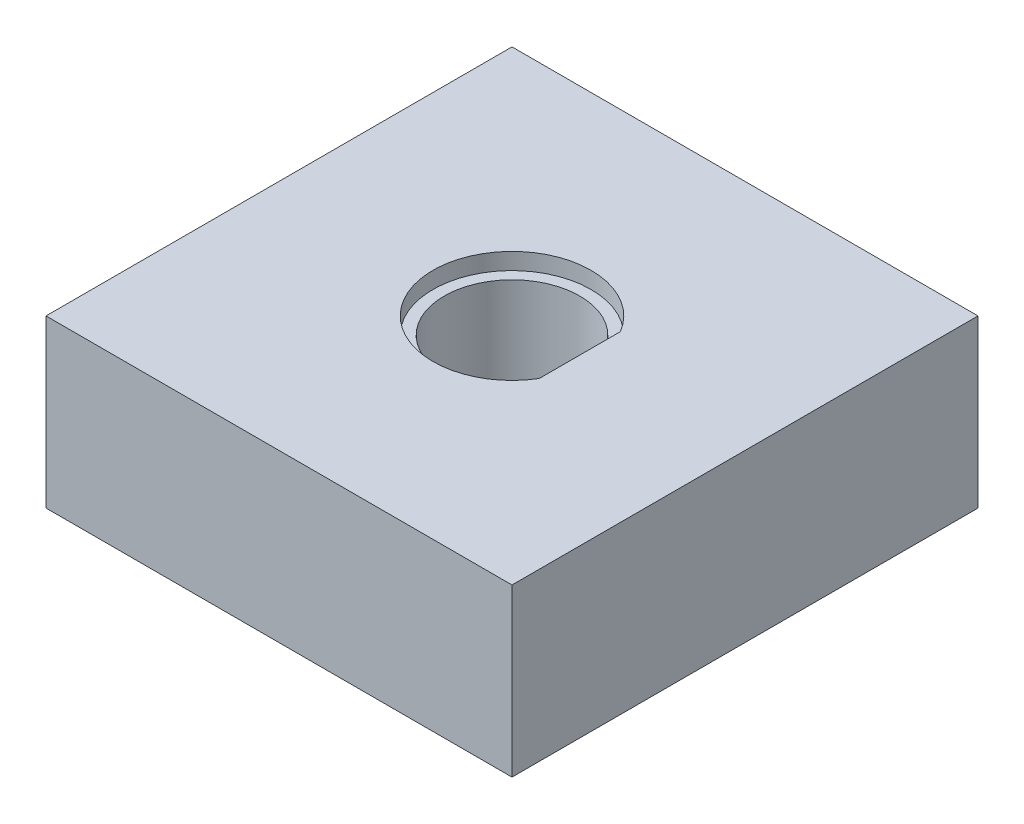
ISO-10303-21;
HEADER;
FILE_DESCRIPTION(('STEP AP214'),'2;1');
FILE_NAME('part.step','',(''),(''),'','','');
FILE_SCHEMA(('AUTOMOTIVE_DESIGN { 1 0 10303 214 1 1 1 1 }'));
ENDSEC;
DATA;
#1=APPLICATION_CONTEXT('core data for automotive mechanical design processes');
#2=APPLICATION_PROTOCOL_DEFINITION('international standard','automotive_design',2000,#1);
#3=PRODUCT_CONTEXT('',#1,'mechanical');
#4=PRODUCT('Part','Part','',(#3));
#5=PRODUCT_RELATED_PRODUCT_CATEGORY('part','',(#4));
#6=PRODUCT_DEFINITION_FORMATION('','',#4);
#7=PRODUCT_DEFINITION_CONTEXT('part definition',#1,'design');
#8=PRODUCT_DEFINITION('design','',#6,#7);
#9=PRODUCT_DEFINITION_SHAPE('','',#8);
#10=(LENGTH_UNIT() NAMED_UNIT(*) SI_UNIT(.MILLI.,.METRE.));
#11=(NAMED_UNIT(*) PLANE_ANGLE_UNIT() SI_UNIT($,.RADIAN.));
#12=(NAMED_UNIT(*) SI_UNIT($,.STERADIAN.) SOLID_ANGLE_UNIT());
#13=UNCERTAINTY_MEASURE_WITH_UNIT(LENGTH_MEASURE(1.E-05),#10,'distance_accuracy_value','');
#14=(GEOMETRIC_REPRESENTATION_CONTEXT(3) GLOBAL_UNCERTAINTY_ASSIGNED_CONTEXT((#13)) GLOBAL_UNIT_ASSIGNED_CONTEXT((#10,
#11,#12)) REPRESENTATION_CONTEXT('',''));
#15=CARTESIAN_POINT('',(0.,0.,0.));
#16=DIRECTION('',(0.,0.,1.));
#17=DIRECTION('',(1.,0.,0.));
#18=AXIS2_PLACEMENT_3D('',#15,#16,#17);
#19=CARTESIAN_POINT('',(0.,0.,0.));
#20=DIRECTION('',(0.,1.,0.));
#21=DIRECTION('',(0.,0.,1.));
#22=AXIS2_PLACEMENT_3D('',#19,#20,#21);
#23=CYLINDRICAL_SURFACE('',#22,4.075);
#24=CARTESIAN_POINT('',(0.,0.,0.));
#25=DIRECTION('',(0.,1.,0.));
#26=DIRECTION('',(0.,0.,1.));
#27=AXIS2_PLACEMENT_3D('',#24,#25,#26);
#28=CIRCLE('',#27,4.075);
#29=CARTESIAN_POINT('',(0.,0.,4.075));
#30=VERTEX_POINT('',#29);
#31=EDGE_CURVE('E122',#30,#30,#28,.T.);
#32=ORIENTED_EDGE('',*,*,#31,.F.);
#33=EDGE_LOOP('',(#32));
#34=FACE_BOUND('',#33,.T.);
#35=CARTESIAN_POINT('',(0.,9.,0.));
#36=DIRECTION('',(0.,1.,0.));
#37=DIRECTION('',(0.,0.,1.));
#38=AXIS2_PLACEMENT_3D('',#35,#36,#37);
#39=CIRCLE('',#38,4.075);
#40=CARTESIAN_POINT('',(4.075,9.,0.));
#41=VERTEX_POINT('',#40);
#42=EDGE_CURVE('E11',#41,#41,#39,.F.);
#43=ORIENTED_EDGE('',*,*,#42,.F.);
#44=EDGE_LOOP('',(#43));
#45=FACE_BOUND('',#44,.T.);
#46=ADVANCED_FACE('F41',(#34,#45),#23,.F.);
#47=CARTESIAN_POINT('',(14.,10.,14.));
#48=DIRECTION('',(-1.,0.,0.));
#49=DIRECTION('',(0.,0.,1.));
#50=AXIS2_PLACEMENT_3D('',#47,#48,#49);
#51=PLANE('',#50);
#52=DIRECTION('',(0.,0.,-1.));
#53=VECTOR('',#52,1.);
#54=CARTESIAN_POINT('',(14.,0.,14.));
#55=LINE('',#54,#53);
#56=CARTESIAN_POINT('',(14.,0.,14.));
#57=VERTEX_POINT('',#56);
#58=CARTESIAN_POINT('',(14.,0.,-14.));
#59=VERTEX_POINT('',#58);
#60=EDGE_CURVE('E127',#57,#59,#55,.T.);
#61=ORIENTED_EDGE('',*,*,#60,.T.);
#62=DIRECTION('',(0.,-1.,0.));
#63=VECTOR('',#62,1.);
#64=CARTESIAN_POINT('',(14.,10.,-14.));
#65=LINE('',#64,#63);
#66=CARTESIAN_POINT('',(14.,10.,-14.));
#67=VERTEX_POINT('',#66);
#68=EDGE_CURVE('E50',#67,#59,#65,.T.);
#69=ORIENTED_EDGE('',*,*,#68,.F.);
#70=DIRECTION('',(0.,0.,-1.));
#71=VECTOR('',#70,1.);
#72=CARTESIAN_POINT('',(14.,10.,14.));
#73=LINE('',#72,#71);
#74=CARTESIAN_POINT('',(14.,10.,14.));
#75=VERTEX_POINT('',#74);
#76=EDGE_CURVE('E128',#75,#67,#73,.T.);
#77=ORIENTED_EDGE('',*,*,#76,.F.);
#78=DIRECTION('',(0.,-1.,0.));
#79=VECTOR('',#78,1.);
#80=CARTESIAN_POINT('',(14.,10.,14.));
#81=LINE('',#80,#79);
#82=EDGE_CURVE('E142',#75,#57,#81,.T.);
#83=ORIENTED_EDGE('',*,*,#82,.T.);
#84=EDGE_LOOP('',(#61,#69,#77,#83));
#85=FACE_BOUND('',#84,.T.);
#86=ADVANCED_FACE('F43',(#85),#51,.F.);
#87=CARTESIAN_POINT('',(-14.,10.,-14.));
#88=DIRECTION('',(0.,0.,1.));
#89=DIRECTION('',(1.,0.,0.));
#90=AXIS2_PLACEMENT_3D('',#87,#88,#89);
#91=PLANE('',#90);
#92=DIRECTION('',(-1.,0.,0.));
#93=VECTOR('',#92,1.);
#94=CARTESIAN_POINT('',(-14.,0.,-14.));
#95=LINE('',#94,#93);
#96=CARTESIAN_POINT('',(-14.,0.,-14.));
#97=VERTEX_POINT('',#96);
#98=EDGE_CURVE('E146',#59,#97,#95,.T.);
#99=ORIENTED_EDGE('',*,*,#98,.T.);
#100=DIRECTION('',(0.,-1.,0.));
#101=VECTOR('',#100,1.);
#102=CARTESIAN_POINT('',(-14.,10.,-14.));
#103=LINE('',#102,#101);
#104=CARTESIAN_POINT('',(-14.,10.,-14.));
#105=VERTEX_POINT('',#104);
#106=EDGE_CURVE('E161',#105,#97,#103,.T.);
#107=ORIENTED_EDGE('',*,*,#106,.F.);
#108=DIRECTION('',(-1.,0.,0.));
#109=VECTOR('',#108,1.);
#110=CARTESIAN_POINT('',(-14.,10.,-14.));
#111=LINE('',#110,#109);
#112=EDGE_CURVE('E132',#67,#105,#111,.T.);
#113=ORIENTED_EDGE('',*,*,#112,.F.);
#114=ORIENTED_EDGE('',*,*,#68,.T.);
#115=EDGE_LOOP('',(#99,#107,#113,#114));
#116=FACE_BOUND('',#115,.T.);
#117=ADVANCED_FACE('F168',(#116),#91,.F.);
#118=CARTESIAN_POINT('',(-14.,10.,14.));
#119=DIRECTION('',(1.,0.,0.));
#120=DIRECTION('',(0.,0.,-1.));
#121=AXIS2_PLACEMENT_3D('',#118,#119,#120);
#122=PLANE('',#121);
#123=DIRECTION('',(0.,0.,1.));
#124=VECTOR('',#123,1.);
#125=CARTESIAN_POINT('',(-14.,0.,14.));
#126=LINE('',#125,#124);
#127=CARTESIAN_POINT('',(-14.,0.,14.));
#128=VERTEX_POINT('',#127);
#129=EDGE_CURVE('E149',#97,#128,#126,.T.);
#130=ORIENTED_EDGE('',*,*,#129,.T.);
#131=DIRECTION('',(0.,-1.,0.));
#132=VECTOR('',#131,1.);
#133=CARTESIAN_POINT('',(-14.,10.,14.));
#134=LINE('',#133,#132);
#135=CARTESIAN_POINT('',(-14.,10.,14.));
#136=VERTEX_POINT('',#135);
#137=EDGE_CURVE('E157',#136,#128,#134,.T.);
#138=ORIENTED_EDGE('',*,*,#137,.F.);
#139=DIRECTION('',(0.,0.,1.));
#140=VECTOR('',#139,1.);
#141=CARTESIAN_POINT('',(-14.,10.,14.));
#142=LINE('',#141,#140);
#143=EDGE_CURVE('E136',#105,#136,#142,.T.);
#144=ORIENTED_EDGE('',*,*,#143,.F.);
#145=ORIENTED_EDGE('',*,*,#106,.T.);
#146=EDGE_LOOP('',(#130,#138,#144,#145));
#147=FACE_BOUND('',#146,.T.);
#148=ADVANCED_FACE('F180',(#147),#122,.F.);
#149=CARTESIAN_POINT('',(-14.,10.,14.));
#150=DIRECTION('',(0.,0.,-1.));
#151=DIRECTION('',(-1.,0.,0.));
#152=AXIS2_PLACEMENT_3D('',#149,#150,#151);
#153=PLANE('',#152);
#154=DIRECTION('',(1.,0.,0.));
#155=VECTOR('',#154,1.);
#156=CARTESIAN_POINT('',(-14.,0.,14.));
#157=LINE('',#156,#155);
#158=EDGE_CURVE('E133',#128,#57,#157,.T.);
#159=ORIENTED_EDGE('',*,*,#158,.T.);
#160=ORIENTED_EDGE('',*,*,#82,.F.);
#161=DIRECTION('',(1.,0.,0.));
#162=VECTOR('',#161,1.);
#163=CARTESIAN_POINT('',(-14.,10.,14.));
#164=LINE('',#163,#162);
#165=EDGE_CURVE('E139',#136,#75,#164,.T.);
#166=ORIENTED_EDGE('',*,*,#165,.F.);
#167=ORIENTED_EDGE('',*,*,#137,.T.);
#168=EDGE_LOOP('',(#159,#160,#166,#167));
#169=FACE_BOUND('',#168,.T.);
#170=ADVANCED_FACE('F184',(#169),#153,.F.);
#171=CARTESIAN_POINT('',(0.,10.,0.));
#172=DIRECTION('',(0.,-1.,0.));
#173=DIRECTION('',(0.,0.,-1.));
#174=AXIS2_PLACEMENT_3D('',#171,#172,#173);
#175=PLANE('',#174);
#176=DIRECTION('',(0.,0.,-1.));
#177=VECTOR('',#176,1.);
#178=CARTESIAN_POINT('',(4.075,10.,2.44067101429095));
#179=LINE('',#178,#177);
#180=CARTESIAN_POINT('',(4.075,10.,2.44067101429095));
#181=VERTEX_POINT('',#180);
#182=CARTESIAN_POINT('',(4.075,10.,-2.44067101429095));
#183=VERTEX_POINT('',#182);
#184=EDGE_CURVE('E110',#181,#183,#179,.T.);
#185=ORIENTED_EDGE('',*,*,#184,.F.);
#186=CARTESIAN_POINT('',(0.,10.,0.));
#187=DIRECTION('',(0.,1.,0.));
#188=DIRECTION('',(0.,0.,1.));
#189=AXIS2_PLACEMENT_3D('',#186,#187,#188);
#190=CIRCLE('',#189,4.75);
#191=EDGE_CURVE('E57',#183,#181,#190,.T.);
#192=ORIENTED_EDGE('',*,*,#191,.F.);
#193=EDGE_LOOP('',(#185,#192));
#194=FACE_BOUND('',#193,.T.);
#195=ORIENTED_EDGE('',*,*,#76,.T.);
#196=ORIENTED_EDGE('',*,*,#112,.T.);
#197=ORIENTED_EDGE('',*,*,#143,.T.);
#198=ORIENTED_EDGE('',*,*,#165,.T.);
#199=EDGE_LOOP('',(#195,#196,#197,#198));
#200=FACE_BOUND('',#199,.T.);
#201=ADVANCED_FACE('F186',(#194,#200),#175,.F.);
#202=CARTESIAN_POINT('',(0.,0.,0.));
#203=DIRECTION('',(0.,-1.,0.));
#204=DIRECTION('',(0.,0.,-1.));
#205=AXIS2_PLACEMENT_3D('',#202,#203,#204);
#206=PLANE('',#205);
#207=ORIENTED_EDGE('',*,*,#31,.T.);
#208=EDGE_LOOP('',(#207));
#209=FACE_BOUND('',#208,.T.);
#210=ORIENTED_EDGE('',*,*,#60,.F.);
#211=ORIENTED_EDGE('',*,*,#158,.F.);
#212=ORIENTED_EDGE('',*,*,#129,.F.);
#213=ORIENTED_EDGE('',*,*,#98,.F.);
#214=EDGE_LOOP('',(#210,#211,#212,#213));
#215=FACE_BOUND('',#214,.T.);
#216=ADVANCED_FACE('F176',(#209,#215),#206,.T.);
#217=CARTESIAN_POINT('',(4.075,9.,2.44067101429095));
#218=DIRECTION('',(1.,0.,0.));
#219=DIRECTION('',(0.,0.,-1.));
#220=AXIS2_PLACEMENT_3D('',#217,#218,#219);
#221=PLANE('',#220);
#222=ORIENTED_EDGE('',*,*,#184,.T.);
#223=DIRECTION('',(0.,1.,0.));
#224=VECTOR('',#223,1.);
#225=CARTESIAN_POINT('',(4.075,9.,-2.44067101429095));
#226=LINE('',#225,#224);
#227=CARTESIAN_POINT('',(4.075,9.,-2.44067101429095));
#228=VERTEX_POINT('',#227);
#229=EDGE_CURVE('E104',#228,#183,#226,.T.);
#230=ORIENTED_EDGE('',*,*,#229,.F.);
#231=DIRECTION('',(0.,0.,-1.));
#232=VECTOR('',#231,1.);
#233=CARTESIAN_POINT('',(4.075,9.,2.44067101429095));
#234=LINE('',#233,#232);
#235=EDGE_CURVE('E107',#41,#228,#234,.T.);
#236=ORIENTED_EDGE('',*,*,#235,.F.);
#237=CARTESIAN_POINT('',(4.075,9.,2.44067101429095));
#238=VERTEX_POINT('',#237);
#239=EDGE_CURVE('E64',#238,#41,#234,.T.);
#240=ORIENTED_EDGE('',*,*,#239,.F.);
#241=DIRECTION('',(0.,1.,0.));
#242=VECTOR('',#241,1.);
#243=CARTESIAN_POINT('',(4.075,9.,2.44067101429095));
#244=LINE('',#243,#242);
#245=EDGE_CURVE('E98',#238,#181,#244,.T.);
#246=ORIENTED_EDGE('',*,*,#245,.T.);
#247=EDGE_LOOP('',(#222,#230,#236,#240,#246));
#248=FACE_BOUND('',#247,.T.);
#249=ADVANCED_FACE('F112',(#248),#221,.F.);
#250=CARTESIAN_POINT('',(0.,9.,0.));
#251=DIRECTION('',(0.,1.,0.));
#252=DIRECTION('',(0.,0.,1.));
#253=AXIS2_PLACEMENT_3D('',#250,#251,#252);
#254=PLANE('',#253);
#255=ORIENTED_EDGE('',*,*,#235,.T.);
#256=CARTESIAN_POINT('',(0.,9.,0.));
#257=DIRECTION('',(0.,1.,0.));
#258=DIRECTION('',(0.,0.,1.));
#259=AXIS2_PLACEMENT_3D('',#256,#257,#258);
#260=CIRCLE('',#259,4.75);
#261=EDGE_CURVE('E100',#228,#238,#260,.T.);
#262=ORIENTED_EDGE('',*,*,#261,.T.);
#263=ORIENTED_EDGE('',*,*,#239,.T.);
#264=ORIENTED_EDGE('',*,*,#42,.T.);
#265=EDGE_LOOP('',(#255,#262,#263,#264));
#266=FACE_BOUND('',#265,.T.);
#267=ADVANCED_FACE('F106',(#266),#254,.T.);
#268=CARTESIAN_POINT('',(0.,9.,0.));
#269=DIRECTION('',(0.,1.,0.));
#270=DIRECTION('',(0.,0.,1.));
#271=AXIS2_PLACEMENT_3D('',#268,#269,#270);
#272=CYLINDRICAL_SURFACE('',#271,4.75);
#273=ORIENTED_EDGE('',*,*,#191,.T.);
#274=ORIENTED_EDGE('',*,*,#245,.F.);
#275=ORIENTED_EDGE('',*,*,#261,.F.);
#276=ORIENTED_EDGE('',*,*,#229,.T.);
#277=EDGE_LOOP('',(#273,#274,#275,#276));
#278=FACE_BOUND('',#277,.T.);
#279=ADVANCED_FACE('F99',(#278),#272,.F.);
#280=CLOSED_SHELL('',(#46,#86,#117,#148,#170,#201,#216,#249,#267,#279));
#281=MANIFOLD_SOLID_BREP('B2',#280);
#282=ADVANCED_BREP_SHAPE_REPRESENTATION('',(#18,#281),#14);
#283=SHAPE_DEFINITION_REPRESENTATION(#9,#282);
ENDSEC;
END-ISO-10303-21;
